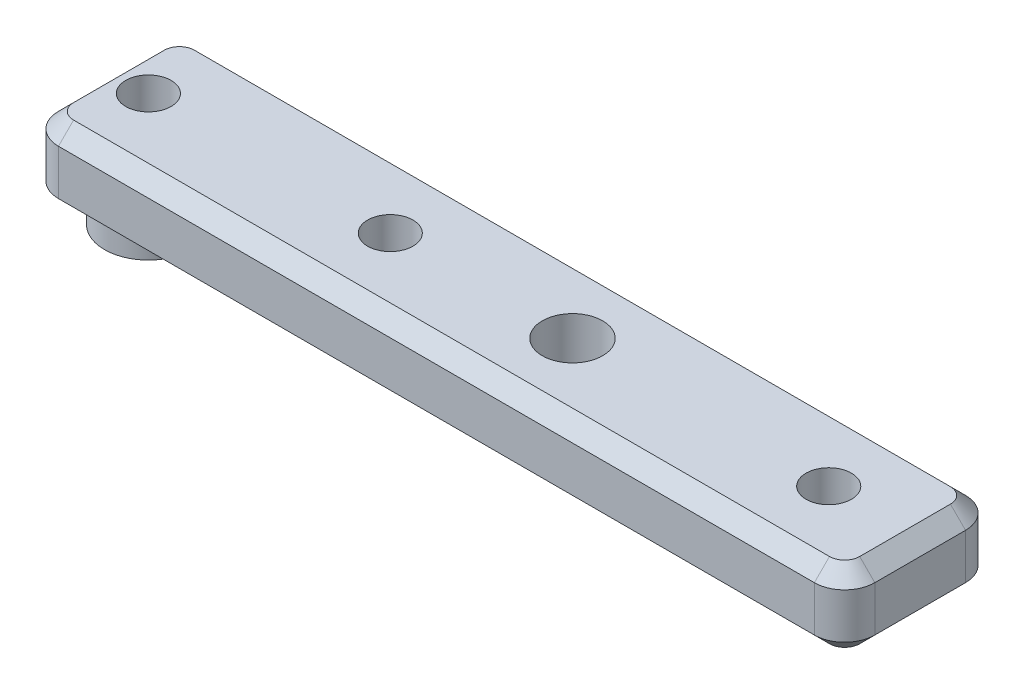
ISO-10303-21;
HEADER;
FILE_DESCRIPTION(('STEP AP214'),'2;1');
FILE_NAME('part.step','',(''),(''),'','','');
FILE_SCHEMA(('AUTOMOTIVE_DESIGN { 1 0 10303 214 1 1 1 1 }'));
ENDSEC;
DATA;
#1=APPLICATION_CONTEXT('core data for automotive mechanical design processes');
#2=APPLICATION_PROTOCOL_DEFINITION('international standard','automotive_design',2000,#1);
#3=PRODUCT_CONTEXT('',#1,'mechanical');
#4=PRODUCT('Part','Part','',(#3));
#5=PRODUCT_RELATED_PRODUCT_CATEGORY('part','',(#4));
#6=PRODUCT_DEFINITION_FORMATION('','',#4);
#7=PRODUCT_DEFINITION_CONTEXT('part definition',#1,'design');
#8=PRODUCT_DEFINITION('design','',#6,#7);
#9=PRODUCT_DEFINITION_SHAPE('','',#8);
#10=(LENGTH_UNIT() NAMED_UNIT(*) SI_UNIT(.MILLI.,.METRE.));
#11=(NAMED_UNIT(*) PLANE_ANGLE_UNIT() SI_UNIT($,.RADIAN.));
#12=(NAMED_UNIT(*) SI_UNIT($,.STERADIAN.) SOLID_ANGLE_UNIT());
#13=UNCERTAINTY_MEASURE_WITH_UNIT(LENGTH_MEASURE(1.E-05),#10,'distance_accuracy_value','');
#14=(GEOMETRIC_REPRESENTATION_CONTEXT(3) GLOBAL_UNCERTAINTY_ASSIGNED_CONTEXT((#13)) GLOBAL_UNIT_ASSIGNED_CONTEXT((#10,
#11,#12)) REPRESENTATION_CONTEXT('',''));
#15=CARTESIAN_POINT('',(0.,0.,0.));
#16=DIRECTION('',(0.,0.,1.));
#17=DIRECTION('',(1.,0.,0.));
#18=AXIS2_PLACEMENT_3D('',#15,#16,#17);
#19=CARTESIAN_POINT('',(27.,5.,-5.));
#20=DIRECTION('',(-1.,0.,0.));
#21=DIRECTION('',(0.,0.,1.));
#22=AXIS2_PLACEMENT_3D('',#19,#20,#21);
#23=PLANE('',#22);
#24=DIRECTION('',(0.,-1.,0.));
#25=VECTOR('',#24,1.);
#26=CARTESIAN_POINT('',(27.,5.,3.));
#27=LINE('',#26,#25);
#28=CARTESIAN_POINT('',(27.,4.00000000000001,3.));
#29=VERTEX_POINT('',#28);
#30=CARTESIAN_POINT('',(27.,1.,3.));
#31=VERTEX_POINT('',#30);
#32=EDGE_CURVE('E201',#29,#31,#27,.T.);
#33=ORIENTED_EDGE('',*,*,#32,.T.);
#34=DIRECTION('',(0.,0.,-1.));
#35=VECTOR('',#34,1.);
#36=CARTESIAN_POINT('',(27.,1.,-5.));
#37=LINE('',#36,#35);
#38=CARTESIAN_POINT('',(27.,1.,-3.));
#39=VERTEX_POINT('',#38);
#40=EDGE_CURVE('E285',#31,#39,#37,.T.);
#41=ORIENTED_EDGE('',*,*,#40,.T.);
#42=DIRECTION('',(0.,-1.,0.));
#43=VECTOR('',#42,1.);
#44=CARTESIAN_POINT('',(27.,5.,-3.));
#45=LINE('',#44,#43);
#46=CARTESIAN_POINT('',(27.,4.00000000000001,-3.));
#47=VERTEX_POINT('',#46);
#48=EDGE_CURVE('E213',#39,#47,#45,.F.);
#49=ORIENTED_EDGE('',*,*,#48,.T.);
#50=DIRECTION('',(0.,0.,1.));
#51=VECTOR('',#50,1.);
#52=CARTESIAN_POINT('',(27.,4.00000000000001,3.));
#53=LINE('',#52,#51);
#54=EDGE_CURVE('E279',#47,#29,#53,.T.);
#55=ORIENTED_EDGE('',*,*,#54,.T.);
#56=EDGE_LOOP('',(#33,#41,#49,#55));
#57=FACE_BOUND('',#56,.T.);
#58=ADVANCED_FACE('F44',(#57),#23,.F.);
#59=CARTESIAN_POINT('',(-27.,5.,-5.));
#60=DIRECTION('',(0.,0.,1.));
#61=DIRECTION('',(1.,0.,0.));
#62=AXIS2_PLACEMENT_3D('',#59,#60,#61);
#63=PLANE('',#62);
#64=DIRECTION('',(0.,-1.,0.));
#65=VECTOR('',#64,1.);
#66=CARTESIAN_POINT('',(25.,5.,-5.));
#67=LINE('',#66,#65);
#68=CARTESIAN_POINT('',(25.,4.00000000000001,-5.));
#69=VERTEX_POINT('',#68);
#70=CARTESIAN_POINT('',(25.,1.,-5.));
#71=VERTEX_POINT('',#70);
#72=EDGE_CURVE('E194',#69,#71,#67,.T.);
#73=ORIENTED_EDGE('',*,*,#72,.T.);
#74=DIRECTION('',(-1.,0.,0.));
#75=VECTOR('',#74,1.);
#76=CARTESIAN_POINT('',(-27.,1.,-5.));
#77=LINE('',#76,#75);
#78=CARTESIAN_POINT('',(-25.,1.,-5.));
#79=VERTEX_POINT('',#78);
#80=EDGE_CURVE('E196',#71,#79,#77,.T.);
#81=ORIENTED_EDGE('',*,*,#80,.T.);
#82=DIRECTION('',(0.,-1.,0.));
#83=VECTOR('',#82,1.);
#84=CARTESIAN_POINT('',(-25.,5.,-5.));
#85=LINE('',#84,#83);
#86=CARTESIAN_POINT('',(-25.,4.00000000000001,-5.));
#87=VERTEX_POINT('',#86);
#88=EDGE_CURVE('E200',#79,#87,#85,.F.);
#89=ORIENTED_EDGE('',*,*,#88,.T.);
#90=DIRECTION('',(1.,0.,0.));
#91=VECTOR('',#90,1.);
#92=CARTESIAN_POINT('',(25.,4.00000000000001,-5.));
#93=LINE('',#92,#91);
#94=EDGE_CURVE('E171',#87,#69,#93,.T.);
#95=ORIENTED_EDGE('',*,*,#94,.T.);
#96=EDGE_LOOP('',(#73,#81,#89,#95));
#97=FACE_BOUND('',#96,.T.);
#98=ADVANCED_FACE('F195',(#97),#63,.F.);
#99=CARTESIAN_POINT('',(-27.,5.,-5.));
#100=DIRECTION('',(1.,0.,0.));
#101=DIRECTION('',(0.,0.,-1.));
#102=AXIS2_PLACEMENT_3D('',#99,#100,#101);
#103=PLANE('',#102);
#104=DIRECTION('',(0.,-1.,0.));
#105=VECTOR('',#104,1.);
#106=CARTESIAN_POINT('',(-27.,5.,-3.));
#107=LINE('',#106,#105);
#108=CARTESIAN_POINT('',(-27.,4.00000000000001,-3.));
#109=VERTEX_POINT('',#108);
#110=CARTESIAN_POINT('',(-27.,1.,-3.));
#111=VERTEX_POINT('',#110);
#112=EDGE_CURVE('E225',#109,#111,#107,.T.);
#113=ORIENTED_EDGE('',*,*,#112,.T.);
#114=DIRECTION('',(0.,0.,1.));
#115=VECTOR('',#114,1.);
#116=CARTESIAN_POINT('',(-27.,1.,-5.));
#117=LINE('',#116,#115);
#118=CARTESIAN_POINT('',(-27.,1.,3.));
#119=VERTEX_POINT('',#118);
#120=EDGE_CURVE('E278',#111,#119,#117,.T.);
#121=ORIENTED_EDGE('',*,*,#120,.T.);
#122=DIRECTION('',(0.,-1.,0.));
#123=VECTOR('',#122,1.);
#124=CARTESIAN_POINT('',(-27.,5.,3.));
#125=LINE('',#124,#123);
#126=CARTESIAN_POINT('',(-27.,4.00000000000001,3.));
#127=VERTEX_POINT('',#126);
#128=EDGE_CURVE('E218',#119,#127,#125,.F.);
#129=ORIENTED_EDGE('',*,*,#128,.T.);
#130=DIRECTION('',(0.,0.,-1.));
#131=VECTOR('',#130,1.);
#132=CARTESIAN_POINT('',(-27.,4.00000000000001,-3.));
#133=LINE('',#132,#131);
#134=EDGE_CURVE('E271',#127,#109,#133,.T.);
#135=ORIENTED_EDGE('',*,*,#134,.T.);
#136=EDGE_LOOP('',(#113,#121,#129,#135));
#137=FACE_BOUND('',#136,.T.);
#138=ADVANCED_FACE('F470',(#137),#103,.F.);
#139=CARTESIAN_POINT('',(-27.,5.,5.));
#140=DIRECTION('',(0.,0.,-1.));
#141=DIRECTION('',(-1.,0.,0.));
#142=AXIS2_PLACEMENT_3D('',#139,#140,#141);
#143=PLANE('',#142);
#144=DIRECTION('',(0.,-1.,0.));
#145=VECTOR('',#144,1.);
#146=CARTESIAN_POINT('',(-25.,5.,5.));
#147=LINE('',#146,#145);
#148=CARTESIAN_POINT('',(-25.,4.00000000000001,5.));
#149=VERTEX_POINT('',#148);
#150=CARTESIAN_POINT('',(-25.,1.,5.));
#151=VERTEX_POINT('',#150);
#152=EDGE_CURVE('E226',#149,#151,#147,.T.);
#153=ORIENTED_EDGE('',*,*,#152,.T.);
#154=DIRECTION('',(1.,0.,0.));
#155=VECTOR('',#154,1.);
#156=CARTESIAN_POINT('',(-27.,1.,5.));
#157=LINE('',#156,#155);
#158=CARTESIAN_POINT('',(25.,1.,5.));
#159=VERTEX_POINT('',#158);
#160=EDGE_CURVE('E297',#151,#159,#157,.T.);
#161=ORIENTED_EDGE('',*,*,#160,.T.);
#162=DIRECTION('',(0.,-1.,0.));
#163=VECTOR('',#162,1.);
#164=CARTESIAN_POINT('',(25.,5.,5.));
#165=LINE('',#164,#163);
#166=CARTESIAN_POINT('',(25.,4.00000000000001,5.));
#167=VERTEX_POINT('',#166);
#168=EDGE_CURVE('E235',#159,#167,#165,.F.);
#169=ORIENTED_EDGE('',*,*,#168,.T.);
#170=DIRECTION('',(-1.,0.,0.));
#171=VECTOR('',#170,1.);
#172=CARTESIAN_POINT('',(-25.,4.00000000000001,5.));
#173=LINE('',#172,#171);
#174=EDGE_CURVE('E300',#167,#149,#173,.T.);
#175=ORIENTED_EDGE('',*,*,#174,.T.);
#176=EDGE_LOOP('',(#153,#161,#169,#175));
#177=FACE_BOUND('',#176,.T.);
#178=ADVANCED_FACE('F387',(#177),#143,.F.);
#179=CARTESIAN_POINT('',(0.,5.,0.));
#180=DIRECTION('',(0.,1.,0.));
#181=DIRECTION('',(0.,0.,1.));
#182=AXIS2_PLACEMENT_3D('',#179,#180,#181);
#183=PLANE('',#182);
#184=CARTESIAN_POINT('',(25.,5.,-3.));
#185=DIRECTION('',(0.,1.,0.));
#186=DIRECTION('',(0.,0.,1.));
#187=AXIS2_PLACEMENT_3D('',#184,#185,#186);
#188=CIRCLE('',#187,1.);
#189=CARTESIAN_POINT('',(26.,5.,-3.));
#190=VERTEX_POINT('',#189);
#191=CARTESIAN_POINT('',(25.,5.,-4.));
#192=VERTEX_POINT('',#191);
#193=EDGE_CURVE('E74',#190,#192,#188,.T.);
#194=ORIENTED_EDGE('',*,*,#193,.T.);
#195=DIRECTION('',(-1.,0.,0.));
#196=VECTOR('',#195,1.);
#197=CARTESIAN_POINT('',(-25.,5.,-4.00000000000001));
#198=LINE('',#197,#196);
#199=CARTESIAN_POINT('',(-25.,5.,-4.));
#200=VERTEX_POINT('',#199);
#201=EDGE_CURVE('E57',#192,#200,#198,.T.);
#202=ORIENTED_EDGE('',*,*,#201,.T.);
#203=CARTESIAN_POINT('',(-25.,5.,-3.));
#204=DIRECTION('',(0.,1.,0.));
#205=DIRECTION('',(0.,0.,1.));
#206=AXIS2_PLACEMENT_3D('',#203,#204,#205);
#207=CIRCLE('',#206,1.);
#208=CARTESIAN_POINT('',(-26.,5.,-3.));
#209=VERTEX_POINT('',#208);
#210=EDGE_CURVE('E318',#200,#209,#207,.T.);
#211=ORIENTED_EDGE('',*,*,#210,.T.);
#212=DIRECTION('',(0.,0.,1.));
#213=VECTOR('',#212,1.);
#214=CARTESIAN_POINT('',(-26.,5.,3.));
#215=LINE('',#214,#213);
#216=CARTESIAN_POINT('',(-26.,5.,3.));
#217=VERTEX_POINT('',#216);
#218=EDGE_CURVE('E314',#209,#217,#215,.T.);
#219=ORIENTED_EDGE('',*,*,#218,.T.);
#220=CARTESIAN_POINT('',(-25.,5.,3.));
#221=DIRECTION('',(0.,1.,0.));
#222=DIRECTION('',(0.,0.,1.));
#223=AXIS2_PLACEMENT_3D('',#220,#221,#222);
#224=CIRCLE('',#223,1.);
#225=CARTESIAN_POINT('',(-25.,5.,4.00000000000001));
#226=VERTEX_POINT('',#225);
#227=EDGE_CURVE('E307',#217,#226,#224,.T.);
#228=ORIENTED_EDGE('',*,*,#227,.T.);
#229=DIRECTION('',(1.,0.,0.));
#230=VECTOR('',#229,1.);
#231=CARTESIAN_POINT('',(25.,5.,4.00000000000001));
#232=LINE('',#231,#230);
#233=CARTESIAN_POINT('',(25.,5.,4.00000000000001));
#234=VERTEX_POINT('',#233);
#235=EDGE_CURVE('E303',#226,#234,#232,.T.);
#236=ORIENTED_EDGE('',*,*,#235,.T.);
#237=CARTESIAN_POINT('',(25.,5.,3.));
#238=DIRECTION('',(0.,1.,0.));
#239=DIRECTION('',(0.,0.,1.));
#240=AXIS2_PLACEMENT_3D('',#237,#238,#239);
#241=CIRCLE('',#240,1.);
#242=CARTESIAN_POINT('',(26.,5.,3.));
#243=VERTEX_POINT('',#242);
#244=EDGE_CURVE('E306',#234,#243,#241,.T.);
#245=ORIENTED_EDGE('',*,*,#244,.T.);
#246=DIRECTION('',(0.,0.,-1.));
#247=VECTOR('',#246,1.);
#248=CARTESIAN_POINT('',(26.,5.,-3.));
#249=LINE('',#248,#247);
#250=EDGE_CURVE('E315',#243,#190,#249,.T.);
#251=ORIENTED_EDGE('',*,*,#250,.T.);
#252=EDGE_LOOP('',(#194,#202,#211,#219,#228,#236,#245,#251));
#253=FACE_BOUND('',#252,.T.);
#254=CARTESIAN_POINT('',(-24.05,5.,0.));
#255=DIRECTION('',(0.,1.,0.));
#256=DIRECTION('',(0.,0.,1.));
#257=AXIS2_PLACEMENT_3D('',#254,#255,#256);
#258=CIRCLE('',#257,1.5);
#259=CARTESIAN_POINT('',(-24.05,5.,1.5));
#260=VERTEX_POINT('',#259);
#261=EDGE_CURVE('E421',#260,#260,#258,.T.);
#262=ORIENTED_EDGE('',*,*,#261,.F.);
#263=EDGE_LOOP('',(#262));
#264=FACE_BOUND('',#263,.T.);
#265=CARTESIAN_POINT('',(4.,5.,0.));
#266=DIRECTION('',(0.,1.,0.));
#267=DIRECTION('',(0.,0.,1.));
#268=AXIS2_PLACEMENT_3D('',#265,#266,#267);
#269=CIRCLE('',#268,2.);
#270=CARTESIAN_POINT('',(4.,5.,2.));
#271=VERTEX_POINT('',#270);
#272=EDGE_CURVE('E430',#271,#271,#269,.T.);
#273=ORIENTED_EDGE('',*,*,#272,.F.);
#274=EDGE_LOOP('',(#273));
#275=FACE_BOUND('',#274,.T.);
#276=CARTESIAN_POINT('',(-8.05,5.,0.));
#277=DIRECTION('',(0.,1.,0.));
#278=DIRECTION('',(0.,0.,1.));
#279=AXIS2_PLACEMENT_3D('',#276,#277,#278);
#280=CIRCLE('',#279,1.5);
#281=CARTESIAN_POINT('',(-8.05,5.,1.5));
#282=VERTEX_POINT('',#281);
#283=EDGE_CURVE('E431',#282,#282,#280,.T.);
#284=ORIENTED_EDGE('',*,*,#283,.F.);
#285=EDGE_LOOP('',(#284));
#286=FACE_BOUND('',#285,.T.);
#287=CARTESIAN_POINT('',(20.95,5.,0.));
#288=DIRECTION('',(0.,1.,0.));
#289=DIRECTION('',(0.,0.,1.));
#290=AXIS2_PLACEMENT_3D('',#287,#288,#289);
#291=CIRCLE('',#290,1.5);
#292=CARTESIAN_POINT('',(20.95,5.,1.5));
#293=VERTEX_POINT('',#292);
#294=EDGE_CURVE('E432',#293,#293,#291,.T.);
#295=ORIENTED_EDGE('',*,*,#294,.F.);
#296=EDGE_LOOP('',(#295));
#297=FACE_BOUND('',#296,.T.);
#298=ADVANCED_FACE('F660',(#253,#264,#275,#286,#297),#183,.T.);
#299=CARTESIAN_POINT('',(0.,0.,0.));
#300=DIRECTION('',(0.,1.,0.));
#301=DIRECTION('',(0.,0.,1.));
#302=AXIS2_PLACEMENT_3D('',#299,#300,#301);
#303=PLANE('',#302);
#304=CARTESIAN_POINT('',(-24.05,0.,0.));
#305=DIRECTION('',(0.,-1.,0.));
#306=DIRECTION('',(0.,0.,-1.));
#307=AXIS2_PLACEMENT_3D('',#304,#305,#306);
#308=CIRCLE('',#307,2.9);
#309=CARTESIAN_POINT('',(-26.,0.,-2.14650879336658));
#310=VERTEX_POINT('',#309);
#311=CARTESIAN_POINT('',(-26.,0.,2.14650879336658));
#312=VERTEX_POINT('',#311);
#313=EDGE_CURVE('E198',#310,#312,#308,.T.);
#314=ORIENTED_EDGE('',*,*,#313,.F.);
#315=DIRECTION('',(0.,0.,-1.));
#316=VECTOR('',#315,1.);
#317=CARTESIAN_POINT('',(-26.,0.,0.));
#318=LINE('',#317,#316);
#319=CARTESIAN_POINT('',(-26.,0.,-3.));
#320=VERTEX_POINT('',#319);
#321=EDGE_CURVE('E264',#310,#320,#318,.T.);
#322=ORIENTED_EDGE('',*,*,#321,.T.);
#323=CARTESIAN_POINT('',(-25.,0.,-3.));
#324=DIRECTION('',(0.,1.,0.));
#325=DIRECTION('',(0.,0.,1.));
#326=AXIS2_PLACEMENT_3D('',#323,#324,#325);
#327=CIRCLE('',#326,0.999999999999992);
#328=CARTESIAN_POINT('',(-25.,0.,-3.99999999999999));
#329=VERTEX_POINT('',#328);
#330=EDGE_CURVE('E257',#320,#329,#327,.F.);
#331=ORIENTED_EDGE('',*,*,#330,.T.);
#332=DIRECTION('',(1.,0.,0.));
#333=VECTOR('',#332,1.);
#334=CARTESIAN_POINT('',(0.,0.,-3.99999999999999));
#335=LINE('',#334,#333);
#336=CARTESIAN_POINT('',(25.,0.,-3.99999999999999));
#337=VERTEX_POINT('',#336);
#338=EDGE_CURVE('E258',#329,#337,#335,.T.);
#339=ORIENTED_EDGE('',*,*,#338,.T.);
#340=CARTESIAN_POINT('',(25.,0.,-3.));
#341=DIRECTION('',(0.,1.,0.));
#342=DIRECTION('',(0.,0.,1.));
#343=AXIS2_PLACEMENT_3D('',#340,#341,#342);
#344=CIRCLE('',#343,0.99999999999999);
#345=CARTESIAN_POINT('',(26.,0.,-3.));
#346=VERTEX_POINT('',#345);
#347=EDGE_CURVE('E254',#337,#346,#344,.F.);
#348=ORIENTED_EDGE('',*,*,#347,.T.);
#349=DIRECTION('',(0.,0.,1.));
#350=VECTOR('',#349,1.);
#351=CARTESIAN_POINT('',(26.,0.,0.));
#352=LINE('',#351,#350);
#353=CARTESIAN_POINT('',(26.,0.,3.));
#354=VERTEX_POINT('',#353);
#355=EDGE_CURVE('E250',#346,#354,#352,.T.);
#356=ORIENTED_EDGE('',*,*,#355,.T.);
#357=CARTESIAN_POINT('',(25.,0.,3.));
#358=DIRECTION('',(0.,1.,0.));
#359=DIRECTION('',(0.,0.,1.));
#360=AXIS2_PLACEMENT_3D('',#357,#358,#359);
#361=CIRCLE('',#360,0.999999999999992);
#362=CARTESIAN_POINT('',(25.,0.,3.99999999999999));
#363=VERTEX_POINT('',#362);
#364=EDGE_CURVE('E241',#354,#363,#361,.F.);
#365=ORIENTED_EDGE('',*,*,#364,.T.);
#366=DIRECTION('',(-1.,0.,0.));
#367=VECTOR('',#366,1.);
#368=CARTESIAN_POINT('',(0.,0.,3.99999999999999));
#369=LINE('',#368,#367);
#370=CARTESIAN_POINT('',(-25.,0.,3.99999999999999));
#371=VERTEX_POINT('',#370);
#372=EDGE_CURVE('E238',#363,#371,#369,.T.);
#373=ORIENTED_EDGE('',*,*,#372,.T.);
#374=CARTESIAN_POINT('',(-25.,0.,3.));
#375=DIRECTION('',(0.,1.,0.));
#376=DIRECTION('',(0.,0.,1.));
#377=AXIS2_PLACEMENT_3D('',#374,#375,#376);
#378=CIRCLE('',#377,0.99999999999999);
#379=CARTESIAN_POINT('',(-26.,0.,3.));
#380=VERTEX_POINT('',#379);
#381=EDGE_CURVE('E242',#371,#380,#378,.F.);
#382=ORIENTED_EDGE('',*,*,#381,.T.);
#383=DIRECTION('',(0.,0.,-1.));
#384=VECTOR('',#383,1.);
#385=CARTESIAN_POINT('',(-26.,0.,0.));
#386=LINE('',#385,#384);
#387=EDGE_CURVE('E249',#380,#312,#386,.T.);
#388=ORIENTED_EDGE('',*,*,#387,.T.);
#389=EDGE_LOOP('',(#314,#322,#331,#339,#348,#356,#365,#373,#382,#388));
#390=FACE_BOUND('',#389,.T.);
#391=CARTESIAN_POINT('',(4.,0.,0.));
#392=DIRECTION('',(0.,1.,0.));
#393=DIRECTION('',(0.,0.,1.));
#394=AXIS2_PLACEMENT_3D('',#391,#392,#393);
#395=CIRCLE('',#394,2.);
#396=CARTESIAN_POINT('',(4.,0.,2.));
#397=VERTEX_POINT('',#396);
#398=EDGE_CURVE('E214',#397,#397,#395,.T.);
#399=ORIENTED_EDGE('',*,*,#398,.T.);
#400=EDGE_LOOP('',(#399));
#401=FACE_BOUND('',#400,.T.);
#402=CARTESIAN_POINT('',(-8.05,0.,0.));
#403=DIRECTION('',(0.,1.,0.));
#404=DIRECTION('',(0.,0.,1.));
#405=AXIS2_PLACEMENT_3D('',#402,#403,#404);
#406=CIRCLE('',#405,1.5);
#407=CARTESIAN_POINT('',(-8.05,0.,1.5));
#408=VERTEX_POINT('',#407);
#409=EDGE_CURVE('E441',#408,#408,#406,.T.);
#410=ORIENTED_EDGE('',*,*,#409,.T.);
#411=EDGE_LOOP('',(#410));
#412=FACE_BOUND('',#411,.T.);
#413=CARTESIAN_POINT('',(20.95,0.,0.));
#414=DIRECTION('',(0.,1.,0.));
#415=DIRECTION('',(0.,0.,1.));
#416=AXIS2_PLACEMENT_3D('',#413,#414,#415);
#417=CIRCLE('',#416,1.5);
#418=CARTESIAN_POINT('',(20.95,0.,1.5));
#419=VERTEX_POINT('',#418);
#420=EDGE_CURVE('E428',#419,#419,#417,.T.);
#421=ORIENTED_EDGE('',*,*,#420,.T.);
#422=EDGE_LOOP('',(#421));
#423=FACE_BOUND('',#422,.T.);
#424=ADVANCED_FACE('F415',(#390,#401,#412,#423),#303,.F.);
#425=CARTESIAN_POINT('',(20.95,-2.,0.));
#426=DIRECTION('',(0.,1.,0.));
#427=DIRECTION('',(0.,0.,1.));
#428=AXIS2_PLACEMENT_3D('',#425,#426,#427);
#429=CYLINDRICAL_SURFACE('',#428,1.5);
#430=ORIENTED_EDGE('',*,*,#294,.T.);
#431=EDGE_LOOP('',(#430));
#432=FACE_BOUND('',#431,.T.);
#433=ORIENTED_EDGE('',*,*,#420,.F.);
#434=EDGE_LOOP('',(#433));
#435=FACE_BOUND('',#434,.T.);
#436=ADVANCED_FACE('F456',(#432,#435),#429,.F.);
#437=CARTESIAN_POINT('',(-8.05,-2.,0.));
#438=DIRECTION('',(0.,1.,0.));
#439=DIRECTION('',(0.,0.,1.));
#440=AXIS2_PLACEMENT_3D('',#437,#438,#439);
#441=CYLINDRICAL_SURFACE('',#440,1.5);
#442=ORIENTED_EDGE('',*,*,#283,.T.);
#443=EDGE_LOOP('',(#442));
#444=FACE_BOUND('',#443,.T.);
#445=ORIENTED_EDGE('',*,*,#409,.F.);
#446=EDGE_LOOP('',(#445));
#447=FACE_BOUND('',#446,.T.);
#448=ADVANCED_FACE('F453',(#444,#447),#441,.F.);
#449=CARTESIAN_POINT('',(4.,-2.,0.));
#450=DIRECTION('',(0.,1.,0.));
#451=DIRECTION('',(0.,0.,1.));
#452=AXIS2_PLACEMENT_3D('',#449,#450,#451);
#453=CYLINDRICAL_SURFACE('',#452,2.);
#454=ORIENTED_EDGE('',*,*,#272,.T.);
#455=EDGE_LOOP('',(#454));
#456=FACE_BOUND('',#455,.T.);
#457=ORIENTED_EDGE('',*,*,#398,.F.);
#458=EDGE_LOOP('',(#457));
#459=FACE_BOUND('',#458,.T.);
#460=ADVANCED_FACE('F449',(#456,#459),#453,.F.);
#461=CARTESIAN_POINT('',(-24.05,-2.,0.));
#462=DIRECTION('',(0.,1.,0.));
#463=DIRECTION('',(0.,0.,1.));
#464=AXIS2_PLACEMENT_3D('',#461,#462,#463);
#465=CYLINDRICAL_SURFACE('',#464,1.5);
#466=ORIENTED_EDGE('',*,*,#261,.T.);
#467=EDGE_LOOP('',(#466));
#468=FACE_BOUND('',#467,.T.);
#469=CARTESIAN_POINT('',(-24.05,-2.5,0.));
#470=DIRECTION('',(0.,-1.,0.));
#471=DIRECTION('',(0.,0.,-1.));
#472=AXIS2_PLACEMENT_3D('',#469,#470,#471);
#473=CIRCLE('',#472,1.5);
#474=CARTESIAN_POINT('',(-24.05,-2.5,-1.5));
#475=VERTEX_POINT('',#474);
#476=EDGE_CURVE('E355',#475,#475,#473,.T.);
#477=ORIENTED_EDGE('',*,*,#476,.T.);
#478=EDGE_LOOP('',(#477));
#479=FACE_BOUND('',#478,.T.);
#480=ADVANCED_FACE('F448',(#468,#479),#465,.F.);
#481=CARTESIAN_POINT('',(25.,5.,-3.));
#482=DIRECTION('',(0.,-1.,0.));
#483=DIRECTION('',(0.,0.,-1.));
#484=AXIS2_PLACEMENT_3D('',#481,#482,#483);
#485=CYLINDRICAL_SURFACE('',#484,2.);
#486=ORIENTED_EDGE('',*,*,#48,.F.);
#487=CARTESIAN_POINT('',(25.,1.,-3.));
#488=DIRECTION('',(0.,1.,0.));
#489=DIRECTION('',(0.,0.,1.));
#490=AXIS2_PLACEMENT_3D('',#487,#488,#489);
#491=CIRCLE('',#490,2.);
#492=EDGE_CURVE('E187',#39,#71,#491,.T.);
#493=ORIENTED_EDGE('',*,*,#492,.T.);
#494=ORIENTED_EDGE('',*,*,#72,.F.);
#495=CARTESIAN_POINT('',(25.,4.00000000000001,-3.));
#496=DIRECTION('',(0.,1.,0.));
#497=DIRECTION('',(0.,0.,1.));
#498=AXIS2_PLACEMENT_3D('',#495,#496,#497);
#499=CIRCLE('',#498,2.);
#500=EDGE_CURVE('E180',#69,#47,#499,.F.);
#501=ORIENTED_EDGE('',*,*,#500,.T.);
#502=EDGE_LOOP('',(#486,#493,#494,#501));
#503=FACE_BOUND('',#502,.T.);
#504=ADVANCED_FACE('F204',(#503),#485,.T.);
#505=CARTESIAN_POINT('',(-25.,5.,-3.));
#506=DIRECTION('',(0.,-1.,0.));
#507=DIRECTION('',(0.,0.,-1.));
#508=AXIS2_PLACEMENT_3D('',#505,#506,#507);
#509=CYLINDRICAL_SURFACE('',#508,2.);
#510=ORIENTED_EDGE('',*,*,#88,.F.);
#511=CARTESIAN_POINT('',(-25.,1.,-3.));
#512=DIRECTION('',(0.,1.,0.));
#513=DIRECTION('',(0.,0.,1.));
#514=AXIS2_PLACEMENT_3D('',#511,#512,#513);
#515=CIRCLE('',#514,2.);
#516=EDGE_CURVE('E190',#79,#111,#515,.T.);
#517=ORIENTED_EDGE('',*,*,#516,.T.);
#518=ORIENTED_EDGE('',*,*,#112,.F.);
#519=CARTESIAN_POINT('',(-25.,4.00000000000001,-3.));
#520=DIRECTION('',(0.,1.,0.));
#521=DIRECTION('',(0.,0.,1.));
#522=AXIS2_PLACEMENT_3D('',#519,#520,#521);
#523=CIRCLE('',#522,2.);
#524=EDGE_CURVE('E268',#109,#87,#523,.F.);
#525=ORIENTED_EDGE('',*,*,#524,.T.);
#526=EDGE_LOOP('',(#510,#517,#518,#525));
#527=FACE_BOUND('',#526,.T.);
#528=ADVANCED_FACE('F471',(#527),#509,.T.);
#529=CARTESIAN_POINT('',(25.,5.,3.));
#530=DIRECTION('',(0.,-1.,0.));
#531=DIRECTION('',(0.,0.,-1.));
#532=AXIS2_PLACEMENT_3D('',#529,#530,#531);
#533=CYLINDRICAL_SURFACE('',#532,2.);
#534=ORIENTED_EDGE('',*,*,#168,.F.);
#535=CARTESIAN_POINT('',(25.,1.,3.));
#536=DIRECTION('',(0.,1.,0.));
#537=DIRECTION('',(0.,0.,1.));
#538=AXIS2_PLACEMENT_3D('',#535,#536,#537);
#539=CIRCLE('',#538,2.);
#540=EDGE_CURVE('E295',#159,#31,#539,.T.);
#541=ORIENTED_EDGE('',*,*,#540,.T.);
#542=ORIENTED_EDGE('',*,*,#32,.F.);
#543=CARTESIAN_POINT('',(25.,4.00000000000001,3.));
#544=DIRECTION('',(0.,1.,0.));
#545=DIRECTION('',(0.,0.,1.));
#546=AXIS2_PLACEMENT_3D('',#543,#544,#545);
#547=CIRCLE('',#546,2.);
#548=EDGE_CURVE('E293',#29,#167,#547,.F.);
#549=ORIENTED_EDGE('',*,*,#548,.T.);
#550=EDGE_LOOP('',(#534,#541,#542,#549));
#551=FACE_BOUND('',#550,.T.);
#552=ADVANCED_FACE('F477',(#551),#533,.T.);
#553=CARTESIAN_POINT('',(-25.,5.,3.));
#554=DIRECTION('',(0.,-1.,0.));
#555=DIRECTION('',(0.,0.,-1.));
#556=AXIS2_PLACEMENT_3D('',#553,#554,#555);
#557=CYLINDRICAL_SURFACE('',#556,2.);
#558=ORIENTED_EDGE('',*,*,#128,.F.);
#559=CARTESIAN_POINT('',(-25.,1.,3.));
#560=DIRECTION('',(0.,1.,0.));
#561=DIRECTION('',(0.,0.,1.));
#562=AXIS2_PLACEMENT_3D('',#559,#560,#561);
#563=CIRCLE('',#562,2.);
#564=EDGE_CURVE('E287',#119,#151,#563,.T.);
#565=ORIENTED_EDGE('',*,*,#564,.T.);
#566=ORIENTED_EDGE('',*,*,#152,.F.);
#567=CARTESIAN_POINT('',(-25.,4.00000000000001,3.));
#568=DIRECTION('',(0.,1.,0.));
#569=DIRECTION('',(0.,0.,1.));
#570=AXIS2_PLACEMENT_3D('',#567,#568,#569);
#571=CIRCLE('',#570,2.);
#572=EDGE_CURVE('E283',#149,#127,#571,.F.);
#573=ORIENTED_EDGE('',*,*,#572,.T.);
#574=EDGE_LOOP('',(#558,#565,#566,#573));
#575=FACE_BOUND('',#574,.T.);
#576=ADVANCED_FACE('F393',(#575),#557,.T.);
#577=CARTESIAN_POINT('',(-24.05,-2.5,0.));
#578=DIRECTION('',(0.,-1.,0.));
#579=DIRECTION('',(0.,0.,-1.));
#580=AXIS2_PLACEMENT_3D('',#577,#578,#579);
#581=PLANE('',#580);
#582=CARTESIAN_POINT('',(-24.05,-2.5,0.));
#583=DIRECTION('',(0.,-1.,0.));
#584=DIRECTION('',(0.,0.,-1.));
#585=AXIS2_PLACEMENT_3D('',#582,#583,#584);
#586=CIRCLE('',#585,2.9);
#587=CARTESIAN_POINT('',(-24.05,-2.5,-2.9));
#588=VERTEX_POINT('',#587);
#589=EDGE_CURVE('E423',#588,#588,#586,.T.);
#590=ORIENTED_EDGE('',*,*,#589,.T.);
#591=EDGE_LOOP('',(#590));
#592=FACE_BOUND('',#591,.T.);
#593=ORIENTED_EDGE('',*,*,#476,.F.);
#594=EDGE_LOOP('',(#593));
#595=FACE_BOUND('',#594,.T.);
#596=ADVANCED_FACE('F482',(#592,#595),#581,.T.);
#597=CARTESIAN_POINT('',(-24.05,-2.5,0.));
#598=DIRECTION('',(0.,1.,0.));
#599=DIRECTION('',(0.,0.,1.));
#600=AXIS2_PLACEMENT_3D('',#597,#598,#599);
#601=CYLINDRICAL_SURFACE('',#600,2.9);
#602=ORIENTED_EDGE('',*,*,#589,.F.);
#603=EDGE_LOOP('',(#602));
#604=FACE_BOUND('',#603,.T.);
#605=ORIENTED_EDGE('',*,*,#313,.T.);
#606=CARTESIAN_POINT('',(-24.05,-1.94999999999998,0.));
#607=DIRECTION('',(0.707106781186545,0.70710678118655,0.));
#608=DIRECTION('',(-0.70710678118655,0.707106781186545,0.));
#609=AXIS2_PLACEMENT_3D('',#606,#607,#608);
#610=ELLIPSE('',#609,4.10121933088196,2.9);
#611=EDGE_CURVE('E11',#312,#310,#610,.F.);
#612=ORIENTED_EDGE('',*,*,#611,.T.);
#613=EDGE_LOOP('',(#605,#612));
#614=FACE_BOUND('',#613,.T.);
#615=ADVANCED_FACE('F413',(#604,#614),#601,.T.);
#616=CARTESIAN_POINT('',(-27.,1.,5.));
#617=DIRECTION('',(0.,0.70710678118655,-0.707106781186545));
#618=DIRECTION('',(1.,0.,0.));
#619=AXIS2_PLACEMENT_3D('',#616,#617,#618);
#620=PLANE('',#619);
#621=DIRECTION('',(0.,0.707106781186545,0.70710678118655));
#622=VECTOR('',#621,1.);
#623=CARTESIAN_POINT('',(-25.,0.,3.99999999999999));
#624=LINE('',#623,#622);
#625=EDGE_CURVE('E350',#371,#151,#624,.T.);
#626=ORIENTED_EDGE('',*,*,#625,.F.);
#627=ORIENTED_EDGE('',*,*,#372,.F.);
#628=DIRECTION('',(0.,-0.707106781186545,-0.70710678118655));
#629=VECTOR('',#628,1.);
#630=CARTESIAN_POINT('',(25.,1.,5.));
#631=LINE('',#630,#629);
#632=EDGE_CURVE('E348',#159,#363,#631,.T.);
#633=ORIENTED_EDGE('',*,*,#632,.F.);
#634=ORIENTED_EDGE('',*,*,#160,.F.);
#635=EDGE_LOOP('',(#626,#627,#633,#634));
#636=FACE_BOUND('',#635,.T.);
#637=ADVANCED_FACE('F530',(#636),#620,.F.);
#638=CARTESIAN_POINT('',(25.,0.,3.));
#639=DIRECTION('',(0.,1.,0.));
#640=DIRECTION('',(0.,0.,1.));
#641=AXIS2_PLACEMENT_3D('',#638,#639,#640);
#642=CONICAL_SURFACE('',#641,0.999999999999992,0.785398163397452);
#643=ORIENTED_EDGE('',*,*,#632,.T.);
#644=ORIENTED_EDGE('',*,*,#364,.F.);
#645=DIRECTION('',(-0.70710678118655,-0.707106781186545,0.));
#646=VECTOR('',#645,1.);
#647=CARTESIAN_POINT('',(27.,1.,3.));
#648=LINE('',#647,#646);
#649=EDGE_CURVE('E341',#31,#354,#648,.T.);
#650=ORIENTED_EDGE('',*,*,#649,.F.);
#651=ORIENTED_EDGE('',*,*,#540,.F.);
#652=EDGE_LOOP('',(#643,#644,#650,#651));
#653=FACE_BOUND('',#652,.T.);
#654=ADVANCED_FACE('F524',(#653),#642,.T.);
#655=CARTESIAN_POINT('',(-25.,0.,3.));
#656=DIRECTION('',(0.,1.,0.));
#657=DIRECTION('',(0.,0.,1.));
#658=AXIS2_PLACEMENT_3D('',#655,#656,#657);
#659=CONICAL_SURFACE('',#658,0.99999999999999,0.785398163397453);
#660=ORIENTED_EDGE('',*,*,#625,.T.);
#661=ORIENTED_EDGE('',*,*,#564,.F.);
#662=DIRECTION('',(-0.70710678118655,0.707106781186545,0.));
#663=VECTOR('',#662,1.);
#664=CARTESIAN_POINT('',(-26.,0.,3.));
#665=LINE('',#664,#663);
#666=EDGE_CURVE('E339',#380,#119,#665,.T.);
#667=ORIENTED_EDGE('',*,*,#666,.F.);
#668=ORIENTED_EDGE('',*,*,#381,.F.);
#669=EDGE_LOOP('',(#660,#661,#667,#668));
#670=FACE_BOUND('',#669,.T.);
#671=ADVANCED_FACE('F400',(#670),#659,.T.);
#672=CARTESIAN_POINT('',(27.,1.,-5.));
#673=DIRECTION('',(-0.707106781186545,0.70710678118655,0.));
#674=DIRECTION('',(0.,0.,-1.));
#675=AXIS2_PLACEMENT_3D('',#672,#673,#674);
#676=PLANE('',#675);
#677=ORIENTED_EDGE('',*,*,#649,.T.);
#678=ORIENTED_EDGE('',*,*,#355,.F.);
#679=DIRECTION('',(-0.70710678118655,-0.707106781186545,0.));
#680=VECTOR('',#679,1.);
#681=CARTESIAN_POINT('',(27.,1.,-3.));
#682=LINE('',#681,#680);
#683=EDGE_CURVE('E331',#39,#346,#682,.T.);
#684=ORIENTED_EDGE('',*,*,#683,.F.);
#685=ORIENTED_EDGE('',*,*,#40,.F.);
#686=EDGE_LOOP('',(#677,#678,#684,#685));
#687=FACE_BOUND('',#686,.T.);
#688=ADVANCED_FACE('F512',(#687),#676,.F.);
#689=CARTESIAN_POINT('',(-27.,1.,-5.));
#690=DIRECTION('',(0.707106781186545,0.70710678118655,0.));
#691=DIRECTION('',(0.,0.,1.));
#692=AXIS2_PLACEMENT_3D('',#689,#690,#691);
#693=PLANE('',#692);
#694=ORIENTED_EDGE('',*,*,#666,.T.);
#695=ORIENTED_EDGE('',*,*,#120,.F.);
#696=DIRECTION('',(-0.70710678118655,0.707106781186545,0.));
#697=VECTOR('',#696,1.);
#698=CARTESIAN_POINT('',(-26.,0.,-3.));
#699=LINE('',#698,#697);
#700=EDGE_CURVE('E333',#320,#111,#699,.T.);
#701=ORIENTED_EDGE('',*,*,#700,.F.);
#702=ORIENTED_EDGE('',*,*,#321,.F.);
#703=ORIENTED_EDGE('',*,*,#611,.F.);
#704=ORIENTED_EDGE('',*,*,#387,.F.);
#705=EDGE_LOOP('',(#694,#695,#701,#702,#703,#704));
#706=FACE_BOUND('',#705,.T.);
#707=ADVANCED_FACE('F403',(#706),#693,.F.);
#708=CARTESIAN_POINT('',(25.,0.,-3.));
#709=DIRECTION('',(0.,1.,0.));
#710=DIRECTION('',(0.,0.,1.));
#711=AXIS2_PLACEMENT_3D('',#708,#709,#710);
#712=CONICAL_SURFACE('',#711,0.99999999999999,0.785398163397453);
#713=ORIENTED_EDGE('',*,*,#683,.T.);
#714=ORIENTED_EDGE('',*,*,#347,.F.);
#715=DIRECTION('',(0.,-0.707106781186544,0.707106781186551));
#716=VECTOR('',#715,1.);
#717=CARTESIAN_POINT('',(25.,1.,-5.));
#718=LINE('',#717,#716);
#719=EDGE_CURVE('E329',#71,#337,#718,.T.);
#720=ORIENTED_EDGE('',*,*,#719,.F.);
#721=ORIENTED_EDGE('',*,*,#492,.F.);
#722=EDGE_LOOP('',(#713,#714,#720,#721));
#723=FACE_BOUND('',#722,.T.);
#724=ADVANCED_FACE('F498',(#723),#712,.T.);
#725=CARTESIAN_POINT('',(-25.,0.,-3.));
#726=DIRECTION('',(0.,1.,0.));
#727=DIRECTION('',(0.,0.,1.));
#728=AXIS2_PLACEMENT_3D('',#725,#726,#727);
#729=CONICAL_SURFACE('',#728,0.999999999999992,0.785398163397452);
#730=ORIENTED_EDGE('',*,*,#700,.T.);
#731=ORIENTED_EDGE('',*,*,#516,.F.);
#732=DIRECTION('',(0.,0.707106781186545,-0.70710678118655));
#733=VECTOR('',#732,1.);
#734=CARTESIAN_POINT('',(-25.,0.,-3.99999999999999));
#735=LINE('',#734,#733);
#736=EDGE_CURVE('E322',#329,#79,#735,.T.);
#737=ORIENTED_EDGE('',*,*,#736,.F.);
#738=ORIENTED_EDGE('',*,*,#330,.F.);
#739=EDGE_LOOP('',(#730,#731,#737,#738));
#740=FACE_BOUND('',#739,.T.);
#741=ADVANCED_FACE('F493',(#740),#729,.T.);
#742=CARTESIAN_POINT('',(-27.,1.,-5.));
#743=DIRECTION('',(0.,0.70710678118655,0.707106781186545));
#744=DIRECTION('',(-1.,0.,0.));
#745=AXIS2_PLACEMENT_3D('',#742,#743,#744);
#746=PLANE('',#745);
#747=ORIENTED_EDGE('',*,*,#719,.T.);
#748=ORIENTED_EDGE('',*,*,#338,.F.);
#749=ORIENTED_EDGE('',*,*,#736,.T.);
#750=ORIENTED_EDGE('',*,*,#80,.F.);
#751=EDGE_LOOP('',(#747,#748,#749,#750));
#752=FACE_BOUND('',#751,.T.);
#753=ADVANCED_FACE('F481',(#752),#746,.F.);
#754=CARTESIAN_POINT('',(0.,5.,4.00000000000001));
#755=DIRECTION('',(0.,0.707106781186547,0.707106781186547));
#756=DIRECTION('',(-1.,0.,0.));
#757=AXIS2_PLACEMENT_3D('',#754,#755,#756);
#758=PLANE('',#757);
#759=DIRECTION('',(0.,0.707106781186547,-0.707106781186547));
#760=VECTOR('',#759,1.);
#761=CARTESIAN_POINT('',(-25.,4.00000000000001,5.));
#762=LINE('',#761,#760);
#763=EDGE_CURVE('E367',#149,#226,#762,.T.);
#764=ORIENTED_EDGE('',*,*,#763,.F.);
#765=ORIENTED_EDGE('',*,*,#174,.F.);
#766=DIRECTION('',(0.,-0.707106781186547,0.707106781186547));
#767=VECTOR('',#766,1.);
#768=CARTESIAN_POINT('',(25.,5.,4.00000000000001));
#769=LINE('',#768,#767);
#770=EDGE_CURVE('E49',#234,#167,#769,.T.);
#771=ORIENTED_EDGE('',*,*,#770,.F.);
#772=ORIENTED_EDGE('',*,*,#235,.F.);
#773=EDGE_LOOP('',(#764,#765,#771,#772));
#774=FACE_BOUND('',#773,.T.);
#775=ADVANCED_FACE('F48',(#774),#758,.T.);
#776=CARTESIAN_POINT('',(25.,5.,3.));
#777=DIRECTION('',(0.,-1.,0.));
#778=DIRECTION('',(0.,0.,-1.));
#779=AXIS2_PLACEMENT_3D('',#776,#777,#778);
#780=CONICAL_SURFACE('',#779,1.00000000000001,0.785398163397448);
#781=ORIENTED_EDGE('',*,*,#770,.T.);
#782=ORIENTED_EDGE('',*,*,#548,.F.);
#783=DIRECTION('',(0.707106781186547,-0.707106781186547,0.));
#784=VECTOR('',#783,1.);
#785=CARTESIAN_POINT('',(26.,5.,3.));
#786=LINE('',#785,#784);
#787=EDGE_CURVE('E366',#243,#29,#786,.T.);
#788=ORIENTED_EDGE('',*,*,#787,.F.);
#789=ORIENTED_EDGE('',*,*,#244,.F.);
#790=EDGE_LOOP('',(#781,#782,#788,#789));
#791=FACE_BOUND('',#790,.T.);
#792=ADVANCED_FACE('F384',(#791),#780,.T.);
#793=CARTESIAN_POINT('',(-25.,5.,3.));
#794=DIRECTION('',(0.,-1.,0.));
#795=DIRECTION('',(0.,0.,-1.));
#796=AXIS2_PLACEMENT_3D('',#793,#794,#795);
#797=CONICAL_SURFACE('',#796,1.,0.785398163397449);
#798=ORIENTED_EDGE('',*,*,#763,.T.);
#799=ORIENTED_EDGE('',*,*,#227,.F.);
#800=DIRECTION('',(0.707106781186547,0.707106781186547,0.));
#801=VECTOR('',#800,1.);
#802=CARTESIAN_POINT('',(-27.,4.00000000000001,3.));
#803=LINE('',#802,#801);
#804=EDGE_CURVE('E365',#127,#217,#803,.T.);
#805=ORIENTED_EDGE('',*,*,#804,.F.);
#806=ORIENTED_EDGE('',*,*,#572,.F.);
#807=EDGE_LOOP('',(#798,#799,#805,#806));
#808=FACE_BOUND('',#807,.T.);
#809=ADVANCED_FACE('F570',(#808),#797,.T.);
#810=CARTESIAN_POINT('',(26.,5.,0.));
#811=DIRECTION('',(0.707106781186547,0.707106781186547,0.));
#812=DIRECTION('',(0.,0.,1.));
#813=AXIS2_PLACEMENT_3D('',#810,#811,#812);
#814=PLANE('',#813);
#815=ORIENTED_EDGE('',*,*,#787,.T.);
#816=ORIENTED_EDGE('',*,*,#54,.F.);
#817=DIRECTION('',(0.707106781186547,-0.707106781186547,0.));
#818=VECTOR('',#817,1.);
#819=CARTESIAN_POINT('',(26.,5.,-3.));
#820=LINE('',#819,#818);
#821=EDGE_CURVE('E179',#190,#47,#820,.T.);
#822=ORIENTED_EDGE('',*,*,#821,.F.);
#823=ORIENTED_EDGE('',*,*,#250,.F.);
#824=EDGE_LOOP('',(#815,#816,#822,#823));
#825=FACE_BOUND('',#824,.T.);
#826=ADVANCED_FACE('F557',(#825),#814,.T.);
#827=CARTESIAN_POINT('',(-26.,5.,0.));
#828=DIRECTION('',(-0.707106781186547,0.707106781186547,0.));
#829=DIRECTION('',(0.,0.,-1.));
#830=AXIS2_PLACEMENT_3D('',#827,#828,#829);
#831=PLANE('',#830);
#832=ORIENTED_EDGE('',*,*,#804,.T.);
#833=ORIENTED_EDGE('',*,*,#218,.F.);
#834=DIRECTION('',(0.707106781186547,0.707106781186547,0.));
#835=VECTOR('',#834,1.);
#836=CARTESIAN_POINT('',(-27.,4.00000000000001,-3.));
#837=LINE('',#836,#835);
#838=EDGE_CURVE('E172',#109,#209,#837,.T.);
#839=ORIENTED_EDGE('',*,*,#838,.F.);
#840=ORIENTED_EDGE('',*,*,#134,.F.);
#841=EDGE_LOOP('',(#832,#833,#839,#840));
#842=FACE_BOUND('',#841,.T.);
#843=ADVANCED_FACE('F555',(#842),#831,.T.);
#844=CARTESIAN_POINT('',(25.,5.,-3.));
#845=DIRECTION('',(0.,-1.,0.));
#846=DIRECTION('',(0.,0.,-1.));
#847=AXIS2_PLACEMENT_3D('',#844,#845,#846);
#848=CONICAL_SURFACE('',#847,1.,0.785398163397449);
#849=ORIENTED_EDGE('',*,*,#821,.T.);
#850=ORIENTED_EDGE('',*,*,#500,.F.);
#851=DIRECTION('',(0.,-0.707106781186547,-0.707106781186548));
#852=VECTOR('',#851,1.);
#853=CARTESIAN_POINT('',(25.,5.,-4.));
#854=LINE('',#853,#852);
#855=EDGE_CURVE('E170',#192,#69,#854,.T.);
#856=ORIENTED_EDGE('',*,*,#855,.F.);
#857=ORIENTED_EDGE('',*,*,#193,.F.);
#858=EDGE_LOOP('',(#849,#850,#856,#857));
#859=FACE_BOUND('',#858,.T.);
#860=ADVANCED_FACE('F178',(#859),#848,.T.);
#861=CARTESIAN_POINT('',(-25.,5.,-3.));
#862=DIRECTION('',(0.,-1.,0.));
#863=DIRECTION('',(0.,0.,-1.));
#864=AXIS2_PLACEMENT_3D('',#861,#862,#863);
#865=CONICAL_SURFACE('',#864,1.00000000000001,0.785398163397448);
#866=ORIENTED_EDGE('',*,*,#838,.T.);
#867=ORIENTED_EDGE('',*,*,#210,.F.);
#868=DIRECTION('',(0.,0.707106781186547,0.707106781186548));
#869=VECTOR('',#868,1.);
#870=CARTESIAN_POINT('',(-25.,4.00000000000001,-5.));
#871=LINE('',#870,#869);
#872=EDGE_CURVE('E64',#87,#200,#871,.T.);
#873=ORIENTED_EDGE('',*,*,#872,.F.);
#874=ORIENTED_EDGE('',*,*,#524,.F.);
#875=EDGE_LOOP('',(#866,#867,#873,#874));
#876=FACE_BOUND('',#875,.T.);
#877=ADVANCED_FACE('F545',(#876),#865,.T.);
#878=CARTESIAN_POINT('',(0.,5.,-4.00000000000001));
#879=DIRECTION('',(0.,0.707106781186547,-0.707106781186547));
#880=DIRECTION('',(1.,0.,0.));
#881=AXIS2_PLACEMENT_3D('',#878,#879,#880);
#882=PLANE('',#881);
#883=ORIENTED_EDGE('',*,*,#855,.T.);
#884=ORIENTED_EDGE('',*,*,#94,.F.);
#885=ORIENTED_EDGE('',*,*,#872,.T.);
#886=ORIENTED_EDGE('',*,*,#201,.F.);
#887=EDGE_LOOP('',(#883,#884,#885,#886));
#888=FACE_BOUND('',#887,.T.);
#889=ADVANCED_FACE('F169',(#888),#882,.T.);
#890=CLOSED_SHELL('',(#58,#98,#138,#178,#298,#424,#436,#448,#460,#480,#504,#528,#552,#576,#596,
#615,#637,#654,#671,#688,#707,#724,#741,#753,#775,#792,#809,#826,#843,#860,#877,#889));
#891=MANIFOLD_SOLID_BREP('B2',#890);
#892=ADVANCED_BREP_SHAPE_REPRESENTATION('',(#18,#891),#14);
#893=SHAPE_DEFINITION_REPRESENTATION(#9,#892);
ENDSEC;
END-ISO-10303-21;
